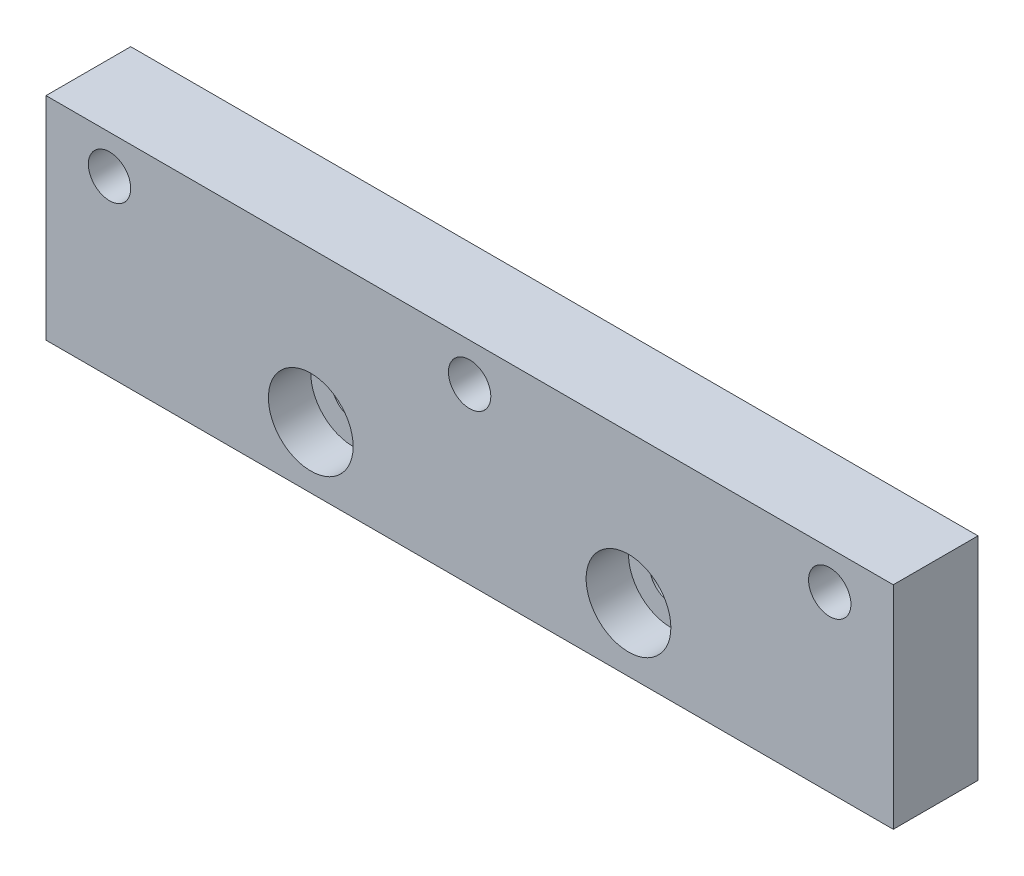
ISO-10303-21;
HEADER;
FILE_DESCRIPTION(('STEP AP214'),'2;1');
FILE_NAME('part.step','',(''),(''),'','','');
FILE_SCHEMA(('AUTOMOTIVE_DESIGN { 1 0 10303 214 1 1 1 1 }'));
ENDSEC;
DATA;
#1=APPLICATION_CONTEXT('core data for automotive mechanical design processes');
#2=APPLICATION_PROTOCOL_DEFINITION('international standard','automotive_design',2000,#1);
#3=PRODUCT_CONTEXT('',#1,'mechanical');
#4=PRODUCT('Part','Part','',(#3));
#5=PRODUCT_RELATED_PRODUCT_CATEGORY('part','',(#4));
#6=PRODUCT_DEFINITION_FORMATION('','',#4);
#7=PRODUCT_DEFINITION_CONTEXT('part definition',#1,'design');
#8=PRODUCT_DEFINITION('design','',#6,#7);
#9=PRODUCT_DEFINITION_SHAPE('','',#8);
#10=(LENGTH_UNIT() NAMED_UNIT(*) SI_UNIT(.MILLI.,.METRE.));
#11=(NAMED_UNIT(*) PLANE_ANGLE_UNIT() SI_UNIT($,.RADIAN.));
#12=(NAMED_UNIT(*) SI_UNIT($,.STERADIAN.) SOLID_ANGLE_UNIT());
#13=UNCERTAINTY_MEASURE_WITH_UNIT(LENGTH_MEASURE(1.E-05),#10,'distance_accuracy_value','');
#14=(GEOMETRIC_REPRESENTATION_CONTEXT(3) GLOBAL_UNCERTAINTY_ASSIGNED_CONTEXT((#13)) GLOBAL_UNIT_ASSIGNED_CONTEXT((#10,
#11,#12)) REPRESENTATION_CONTEXT('',''));
#15=CARTESIAN_POINT('',(0.,0.,0.));
#16=DIRECTION('',(0.,0.,1.));
#17=DIRECTION('',(1.,0.,0.));
#18=AXIS2_PLACEMENT_3D('',#15,#16,#17);
#19=CARTESIAN_POINT('',(-7.5,-2.,0.));
#20=DIRECTION('',(0.,0.,1.));
#21=DIRECTION('',(1.,0.,0.));
#22=AXIS2_PLACEMENT_3D('',#19,#20,#21);
#23=CYLINDRICAL_SURFACE('',#22,1.);
#24=CARTESIAN_POINT('',(-7.5,-2.,0.));
#25=DIRECTION('',(0.,0.,1.));
#26=DIRECTION('',(1.,0.,0.));
#27=AXIS2_PLACEMENT_3D('',#24,#25,#26);
#28=CIRCLE('',#27,1.);
#29=CARTESIAN_POINT('',(-6.5,-2.,0.));
#30=VERTEX_POINT('',#29);
#31=EDGE_CURVE('E117',#30,#30,#28,.T.);
#32=ORIENTED_EDGE('',*,*,#31,.F.);
#33=EDGE_LOOP('',(#32));
#34=FACE_BOUND('',#33,.T.);
#35=CARTESIAN_POINT('',(-7.5,-2.,2.));
#36=DIRECTION('',(0.,0.,1.));
#37=DIRECTION('',(1.,0.,0.));
#38=AXIS2_PLACEMENT_3D('',#35,#36,#37);
#39=CIRCLE('',#38,1.);
#40=CARTESIAN_POINT('',(-6.5,-2.,2.));
#41=VERTEX_POINT('',#40);
#42=EDGE_CURVE('E40',#41,#41,#39,.F.);
#43=ORIENTED_EDGE('',*,*,#42,.F.);
#44=EDGE_LOOP('',(#43));
#45=FACE_BOUND('',#44,.T.);
#46=ADVANCED_FACE('F36',(#34,#45),#23,.F.);
#47=CARTESIAN_POINT('',(7.5,-2.,0.));
#48=DIRECTION('',(0.,0.,1.));
#49=DIRECTION('',(1.,0.,0.));
#50=AXIS2_PLACEMENT_3D('',#47,#48,#49);
#51=CYLINDRICAL_SURFACE('',#50,1.);
#52=CARTESIAN_POINT('',(7.5,-2.,0.));
#53=DIRECTION('',(0.,0.,1.));
#54=DIRECTION('',(1.,0.,0.));
#55=AXIS2_PLACEMENT_3D('',#52,#53,#54);
#56=CIRCLE('',#55,1.);
#57=CARTESIAN_POINT('',(8.5,-2.,0.));
#58=VERTEX_POINT('',#57);
#59=EDGE_CURVE('E149',#58,#58,#56,.T.);
#60=ORIENTED_EDGE('',*,*,#59,.F.);
#61=EDGE_LOOP('',(#60));
#62=FACE_BOUND('',#61,.T.);
#63=CARTESIAN_POINT('',(7.5,-2.,2.));
#64=DIRECTION('',(0.,0.,1.));
#65=DIRECTION('',(1.,0.,0.));
#66=AXIS2_PLACEMENT_3D('',#63,#64,#65);
#67=CIRCLE('',#66,1.);
#68=CARTESIAN_POINT('',(8.5,-2.,2.));
#69=VERTEX_POINT('',#68);
#70=EDGE_CURVE('E111',#69,#69,#67,.F.);
#71=ORIENTED_EDGE('',*,*,#70,.F.);
#72=EDGE_LOOP('',(#71));
#73=FACE_BOUND('',#72,.T.);
#74=ADVANCED_FACE('F160',(#62,#73),#51,.F.);
#75=CARTESIAN_POINT('',(20.,5.,4.));
#76=DIRECTION('',(-1.,0.,0.));
#77=DIRECTION('',(0.,0.,1.));
#78=AXIS2_PLACEMENT_3D('',#75,#76,#77);
#79=PLANE('',#78);
#80=DIRECTION('',(0.,1.,0.));
#81=VECTOR('',#80,1.);
#82=CARTESIAN_POINT('',(20.,5.,0.));
#83=LINE('',#82,#81);
#84=CARTESIAN_POINT('',(20.,-5.,0.));
#85=VERTEX_POINT('',#84);
#86=CARTESIAN_POINT('',(20.,5.,0.));
#87=VERTEX_POINT('',#86);
#88=EDGE_CURVE('E103',#85,#87,#83,.T.);
#89=ORIENTED_EDGE('',*,*,#88,.T.);
#90=DIRECTION('',(0.,0.,-1.));
#91=VECTOR('',#90,1.);
#92=CARTESIAN_POINT('',(20.,5.,4.));
#93=LINE('',#92,#91);
#94=CARTESIAN_POINT('',(20.,5.,4.));
#95=VERTEX_POINT('',#94);
#96=EDGE_CURVE('E11',#95,#87,#93,.T.);
#97=ORIENTED_EDGE('',*,*,#96,.F.);
#98=DIRECTION('',(0.,1.,0.));
#99=VECTOR('',#98,1.);
#100=CARTESIAN_POINT('',(20.,5.,4.));
#101=LINE('',#100,#99);
#102=CARTESIAN_POINT('',(20.,-5.,4.));
#103=VERTEX_POINT('',#102);
#104=EDGE_CURVE('E90',#103,#95,#101,.T.);
#105=ORIENTED_EDGE('',*,*,#104,.F.);
#106=DIRECTION('',(0.,0.,-1.));
#107=VECTOR('',#106,1.);
#108=CARTESIAN_POINT('',(20.,-5.,4.));
#109=LINE('',#108,#107);
#110=EDGE_CURVE('E99',#103,#85,#109,.T.);
#111=ORIENTED_EDGE('',*,*,#110,.T.);
#112=EDGE_LOOP('',(#89,#97,#105,#111));
#113=FACE_BOUND('',#112,.T.);
#114=ADVANCED_FACE('F38',(#113),#79,.F.);
#115=CARTESIAN_POINT('',(-20.,5.,4.));
#116=DIRECTION('',(0.,-1.,0.));
#117=DIRECTION('',(0.,0.,-1.));
#118=AXIS2_PLACEMENT_3D('',#115,#116,#117);
#119=PLANE('',#118);
#120=DIRECTION('',(-1.,0.,0.));
#121=VECTOR('',#120,1.);
#122=CARTESIAN_POINT('',(-20.,5.,0.));
#123=LINE('',#122,#121);
#124=CARTESIAN_POINT('',(-20.,5.,0.));
#125=VERTEX_POINT('',#124);
#126=EDGE_CURVE('E94',#87,#125,#123,.T.);
#127=ORIENTED_EDGE('',*,*,#126,.T.);
#128=DIRECTION('',(0.,0.,-1.));
#129=VECTOR('',#128,1.);
#130=CARTESIAN_POINT('',(-20.,5.,4.));
#131=LINE('',#130,#129);
#132=CARTESIAN_POINT('',(-20.,5.,4.));
#133=VERTEX_POINT('',#132);
#134=EDGE_CURVE('E46',#133,#125,#131,.T.);
#135=ORIENTED_EDGE('',*,*,#134,.F.);
#136=DIRECTION('',(-1.,0.,0.));
#137=VECTOR('',#136,1.);
#138=CARTESIAN_POINT('',(-20.,5.,4.));
#139=LINE('',#138,#137);
#140=EDGE_CURVE('E85',#95,#133,#139,.T.);
#141=ORIENTED_EDGE('',*,*,#140,.F.);
#142=ORIENTED_EDGE('',*,*,#96,.T.);
#143=EDGE_LOOP('',(#127,#135,#141,#142));
#144=FACE_BOUND('',#143,.T.);
#145=ADVANCED_FACE('F93',(#144),#119,.F.);
#146=CARTESIAN_POINT('',(-20.,5.,4.));
#147=DIRECTION('',(1.,0.,0.));
#148=DIRECTION('',(0.,0.,-1.));
#149=AXIS2_PLACEMENT_3D('',#146,#147,#148);
#150=PLANE('',#149);
#151=DIRECTION('',(0.,-1.,0.));
#152=VECTOR('',#151,1.);
#153=CARTESIAN_POINT('',(-20.,5.,0.));
#154=LINE('',#153,#152);
#155=CARTESIAN_POINT('',(-20.,-5.,0.));
#156=VERTEX_POINT('',#155);
#157=EDGE_CURVE('E72',#125,#156,#154,.T.);
#158=ORIENTED_EDGE('',*,*,#157,.T.);
#159=DIRECTION('',(0.,0.,-1.));
#160=VECTOR('',#159,1.);
#161=CARTESIAN_POINT('',(-20.,-5.,4.));
#162=LINE('',#161,#160);
#163=CARTESIAN_POINT('',(-20.,-5.,4.));
#164=VERTEX_POINT('',#163);
#165=EDGE_CURVE('E95',#164,#156,#162,.T.);
#166=ORIENTED_EDGE('',*,*,#165,.F.);
#167=DIRECTION('',(0.,-1.,0.));
#168=VECTOR('',#167,1.);
#169=CARTESIAN_POINT('',(-20.,5.,4.));
#170=LINE('',#169,#168);
#171=EDGE_CURVE('E88',#133,#164,#170,.T.);
#172=ORIENTED_EDGE('',*,*,#171,.F.);
#173=ORIENTED_EDGE('',*,*,#134,.T.);
#174=EDGE_LOOP('',(#158,#166,#172,#173));
#175=FACE_BOUND('',#174,.T.);
#176=ADVANCED_FACE('F97',(#175),#150,.F.);
#177=CARTESIAN_POINT('',(-20.,-5.,4.));
#178=DIRECTION('',(0.,1.,0.));
#179=DIRECTION('',(0.,0.,1.));
#180=AXIS2_PLACEMENT_3D('',#177,#178,#179);
#181=PLANE('',#180);
#182=DIRECTION('',(1.,0.,0.));
#183=VECTOR('',#182,1.);
#184=CARTESIAN_POINT('',(-20.,-5.,0.));
#185=LINE('',#184,#183);
#186=EDGE_CURVE('E78',#156,#85,#185,.T.);
#187=ORIENTED_EDGE('',*,*,#186,.T.);
#188=ORIENTED_EDGE('',*,*,#110,.F.);
#189=DIRECTION('',(1.,0.,0.));
#190=VECTOR('',#189,1.);
#191=CARTESIAN_POINT('',(-20.,-5.,4.));
#192=LINE('',#191,#190);
#193=EDGE_CURVE('E55',#164,#103,#192,.T.);
#194=ORIENTED_EDGE('',*,*,#193,.F.);
#195=ORIENTED_EDGE('',*,*,#165,.T.);
#196=EDGE_LOOP('',(#187,#188,#194,#195));
#197=FACE_BOUND('',#196,.T.);
#198=ADVANCED_FACE('F199',(#197),#181,.F.);
#199=CARTESIAN_POINT('',(0.,0.,4.));
#200=DIRECTION('',(0.,0.,1.));
#201=DIRECTION('',(1.,0.,0.));
#202=AXIS2_PLACEMENT_3D('',#199,#200,#201);
#203=PLANE('',#202);
#204=CARTESIAN_POINT('',(-7.49999999999999,-2.09999999999997,4.));
#205=DIRECTION('',(0.,0.,1.));
#206=DIRECTION('',(1.,0.,0.));
#207=AXIS2_PLACEMENT_3D('',#204,#205,#206);
#208=CIRCLE('',#207,2.);
#209=CARTESIAN_POINT('',(-5.49999999999999,-2.09999999999997,4.));
#210=VERTEX_POINT('',#209);
#211=EDGE_CURVE('E119',#210,#210,#208,.T.);
#212=ORIENTED_EDGE('',*,*,#211,.F.);
#213=EDGE_LOOP('',(#212));
#214=FACE_BOUND('',#213,.T.);
#215=CARTESIAN_POINT('',(7.5,-2.,4.));
#216=DIRECTION('',(0.,0.,1.));
#217=DIRECTION('',(1.,0.,0.));
#218=AXIS2_PLACEMENT_3D('',#215,#216,#217);
#219=CIRCLE('',#218,2.);
#220=CARTESIAN_POINT('',(9.5,-2.,4.));
#221=VERTEX_POINT('',#220);
#222=EDGE_CURVE('E124',#221,#221,#219,.T.);
#223=ORIENTED_EDGE('',*,*,#222,.F.);
#224=EDGE_LOOP('',(#223));
#225=FACE_BOUND('',#224,.T.);
#226=CARTESIAN_POINT('',(-16.9999999999991,3.20000000000005,4.));
#227=DIRECTION('',(0.,0.,1.));
#228=DIRECTION('',(1.,0.,0.));
#229=AXIS2_PLACEMENT_3D('',#226,#227,#228);
#230=CIRCLE('',#229,1.);
#231=CARTESIAN_POINT('',(-15.9999999999991,3.20000000000005,4.));
#232=VERTEX_POINT('',#231);
#233=EDGE_CURVE('E134',#232,#232,#230,.T.);
#234=ORIENTED_EDGE('',*,*,#233,.F.);
#235=EDGE_LOOP('',(#234));
#236=FACE_BOUND('',#235,.T.);
#237=CARTESIAN_POINT('',(8.98586760555986E-13,3.20000000000005,4.));
#238=DIRECTION('',(0.,0.,1.));
#239=DIRECTION('',(1.,0.,0.));
#240=AXIS2_PLACEMENT_3D('',#237,#238,#239);
#241=CIRCLE('',#240,1.);
#242=CARTESIAN_POINT('',(1.0000000000009,3.20000000000005,4.));
#243=VERTEX_POINT('',#242);
#244=EDGE_CURVE('E137',#243,#243,#241,.T.);
#245=ORIENTED_EDGE('',*,*,#244,.F.);
#246=EDGE_LOOP('',(#245));
#247=FACE_BOUND('',#246,.T.);
#248=CARTESIAN_POINT('',(17.0000000000009,3.20000000000005,4.));
#249=DIRECTION('',(0.,0.,1.));
#250=DIRECTION('',(1.,0.,0.));
#251=AXIS2_PLACEMENT_3D('',#248,#249,#250);
#252=CIRCLE('',#251,1.);
#253=CARTESIAN_POINT('',(18.0000000000009,3.20000000000005,4.));
#254=VERTEX_POINT('',#253);
#255=EDGE_CURVE('E143',#254,#254,#252,.T.);
#256=ORIENTED_EDGE('',*,*,#255,.F.);
#257=EDGE_LOOP('',(#256));
#258=FACE_BOUND('',#257,.T.);
#259=ORIENTED_EDGE('',*,*,#104,.T.);
#260=ORIENTED_EDGE('',*,*,#140,.T.);
#261=ORIENTED_EDGE('',*,*,#171,.T.);
#262=ORIENTED_EDGE('',*,*,#193,.T.);
#263=EDGE_LOOP('',(#259,#260,#261,#262));
#264=FACE_BOUND('',#263,.T.);
#265=ADVANCED_FACE('F86',(#214,#225,#236,#247,#258,#264),#203,.T.);
#266=CARTESIAN_POINT('',(0.,0.,0.));
#267=DIRECTION('',(0.,0.,1.));
#268=DIRECTION('',(1.,0.,0.));
#269=AXIS2_PLACEMENT_3D('',#266,#267,#268);
#270=PLANE('',#269);
#271=CARTESIAN_POINT('',(-16.9999999999991,3.20000000000005,0.));
#272=DIRECTION('',(0.,0.,1.));
#273=DIRECTION('',(1.,0.,0.));
#274=AXIS2_PLACEMENT_3D('',#271,#272,#273);
#275=CIRCLE('',#274,1.);
#276=CARTESIAN_POINT('',(-15.9999999999991,3.20000000000005,0.));
#277=VERTEX_POINT('',#276);
#278=EDGE_CURVE('E106',#277,#277,#275,.T.);
#279=ORIENTED_EDGE('',*,*,#278,.T.);
#280=EDGE_LOOP('',(#279));
#281=FACE_BOUND('',#280,.T.);
#282=CARTESIAN_POINT('',(8.98586760555986E-13,3.20000000000005,0.));
#283=DIRECTION('',(0.,0.,1.));
#284=DIRECTION('',(1.,0.,0.));
#285=AXIS2_PLACEMENT_3D('',#282,#283,#284);
#286=CIRCLE('',#285,1.);
#287=CARTESIAN_POINT('',(1.0000000000009,3.20000000000005,0.));
#288=VERTEX_POINT('',#287);
#289=EDGE_CURVE('E140',#288,#288,#286,.T.);
#290=ORIENTED_EDGE('',*,*,#289,.T.);
#291=EDGE_LOOP('',(#290));
#292=FACE_BOUND('',#291,.T.);
#293=CARTESIAN_POINT('',(17.0000000000009,3.20000000000005,0.));
#294=DIRECTION('',(0.,0.,1.));
#295=DIRECTION('',(1.,0.,0.));
#296=AXIS2_PLACEMENT_3D('',#293,#294,#295);
#297=CIRCLE('',#296,1.);
#298=CARTESIAN_POINT('',(18.0000000000009,3.20000000000005,0.));
#299=VERTEX_POINT('',#298);
#300=EDGE_CURVE('E146',#299,#299,#297,.T.);
#301=ORIENTED_EDGE('',*,*,#300,.T.);
#302=EDGE_LOOP('',(#301));
#303=FACE_BOUND('',#302,.T.);
#304=ORIENTED_EDGE('',*,*,#59,.T.);
#305=EDGE_LOOP('',(#304));
#306=FACE_BOUND('',#305,.T.);
#307=ORIENTED_EDGE('',*,*,#31,.T.);
#308=EDGE_LOOP('',(#307));
#309=FACE_BOUND('',#308,.T.);
#310=ORIENTED_EDGE('',*,*,#88,.F.);
#311=ORIENTED_EDGE('',*,*,#186,.F.);
#312=ORIENTED_EDGE('',*,*,#157,.F.);
#313=ORIENTED_EDGE('',*,*,#126,.F.);
#314=EDGE_LOOP('',(#310,#311,#312,#313));
#315=FACE_BOUND('',#314,.T.);
#316=ADVANCED_FACE('F155',(#281,#292,#303,#306,#309,#315),#270,.F.);
#317=CARTESIAN_POINT('',(17.0000000000009,3.20000000000005,0.));
#318=DIRECTION('',(0.,0.,1.));
#319=DIRECTION('',(1.,0.,0.));
#320=AXIS2_PLACEMENT_3D('',#317,#318,#319);
#321=CYLINDRICAL_SURFACE('',#320,1.);
#322=ORIENTED_EDGE('',*,*,#300,.F.);
#323=EDGE_LOOP('',(#322));
#324=FACE_BOUND('',#323,.T.);
#325=ORIENTED_EDGE('',*,*,#255,.T.);
#326=EDGE_LOOP('',(#325));
#327=FACE_BOUND('',#326,.T.);
#328=ADVANCED_FACE('F189',(#324,#327),#321,.F.);
#329=CARTESIAN_POINT('',(8.98586760555986E-13,3.20000000000005,0.));
#330=DIRECTION('',(0.,0.,1.));
#331=DIRECTION('',(1.,0.,0.));
#332=AXIS2_PLACEMENT_3D('',#329,#330,#331);
#333=CYLINDRICAL_SURFACE('',#332,1.);
#334=ORIENTED_EDGE('',*,*,#289,.F.);
#335=EDGE_LOOP('',(#334));
#336=FACE_BOUND('',#335,.T.);
#337=ORIENTED_EDGE('',*,*,#244,.T.);
#338=EDGE_LOOP('',(#337));
#339=FACE_BOUND('',#338,.T.);
#340=ADVANCED_FACE('F185',(#336,#339),#333,.F.);
#341=CARTESIAN_POINT('',(-16.9999999999991,3.20000000000005,0.));
#342=DIRECTION('',(0.,0.,1.));
#343=DIRECTION('',(1.,0.,0.));
#344=AXIS2_PLACEMENT_3D('',#341,#342,#343);
#345=CYLINDRICAL_SURFACE('',#344,1.);
#346=ORIENTED_EDGE('',*,*,#278,.F.);
#347=EDGE_LOOP('',(#346));
#348=FACE_BOUND('',#347,.T.);
#349=ORIENTED_EDGE('',*,*,#233,.T.);
#350=EDGE_LOOP('',(#349));
#351=FACE_BOUND('',#350,.T.);
#352=ADVANCED_FACE('F181',(#348,#351),#345,.F.);
#353=CARTESIAN_POINT('',(7.5,-2.,2.));
#354=DIRECTION('',(0.,0.,1.));
#355=DIRECTION('',(1.,0.,0.));
#356=AXIS2_PLACEMENT_3D('',#353,#354,#355);
#357=PLANE('',#356);
#358=CARTESIAN_POINT('',(7.5,-2.,2.));
#359=DIRECTION('',(0.,0.,1.));
#360=DIRECTION('',(1.,0.,0.));
#361=AXIS2_PLACEMENT_3D('',#358,#359,#360);
#362=CIRCLE('',#361,2.);
#363=CARTESIAN_POINT('',(9.5,-2.,2.));
#364=VERTEX_POINT('',#363);
#365=EDGE_CURVE('E129',#364,#364,#362,.T.);
#366=ORIENTED_EDGE('',*,*,#365,.T.);
#367=EDGE_LOOP('',(#366));
#368=FACE_BOUND('',#367,.T.);
#369=ORIENTED_EDGE('',*,*,#70,.T.);
#370=EDGE_LOOP('',(#369));
#371=FACE_BOUND('',#370,.T.);
#372=ADVANCED_FACE('F175',(#368,#371),#357,.T.);
#373=CARTESIAN_POINT('',(7.5,-2.,2.));
#374=DIRECTION('',(0.,0.,1.));
#375=DIRECTION('',(1.,0.,0.));
#376=AXIS2_PLACEMENT_3D('',#373,#374,#375);
#377=CYLINDRICAL_SURFACE('',#376,2.);
#378=ORIENTED_EDGE('',*,*,#365,.F.);
#379=EDGE_LOOP('',(#378));
#380=FACE_BOUND('',#379,.T.);
#381=ORIENTED_EDGE('',*,*,#222,.T.);
#382=EDGE_LOOP('',(#381));
#383=FACE_BOUND('',#382,.T.);
#384=ADVANCED_FACE('F167',(#380,#383),#377,.F.);
#385=CARTESIAN_POINT('',(-7.49999999999999,-2.09999999999997,2.));
#386=DIRECTION('',(0.,0.,1.));
#387=DIRECTION('',(1.,0.,0.));
#388=AXIS2_PLACEMENT_3D('',#385,#386,#387);
#389=PLANE('',#388);
#390=CARTESIAN_POINT('',(-7.49999999999999,-2.09999999999997,2.));
#391=DIRECTION('',(0.,0.,1.));
#392=DIRECTION('',(1.,0.,0.));
#393=AXIS2_PLACEMENT_3D('',#390,#391,#392);
#394=CIRCLE('',#393,2.);
#395=CARTESIAN_POINT('',(-5.49999999999999,-2.09999999999997,2.));
#396=VERTEX_POINT('',#395);
#397=EDGE_CURVE('E113',#396,#396,#394,.T.);
#398=ORIENTED_EDGE('',*,*,#397,.T.);
#399=EDGE_LOOP('',(#398));
#400=FACE_BOUND('',#399,.T.);
#401=ORIENTED_EDGE('',*,*,#42,.T.);
#402=EDGE_LOOP('',(#401));
#403=FACE_BOUND('',#402,.T.);
#404=ADVANCED_FACE('F164',(#400,#403),#389,.T.);
#405=CARTESIAN_POINT('',(-7.49999999999999,-2.09999999999997,2.));
#406=DIRECTION('',(0.,0.,1.));
#407=DIRECTION('',(1.,0.,0.));
#408=AXIS2_PLACEMENT_3D('',#405,#406,#407);
#409=CYLINDRICAL_SURFACE('',#408,2.);
#410=ORIENTED_EDGE('',*,*,#397,.F.);
#411=EDGE_LOOP('',(#410));
#412=FACE_BOUND('',#411,.T.);
#413=ORIENTED_EDGE('',*,*,#211,.T.);
#414=EDGE_LOOP('',(#413));
#415=FACE_BOUND('',#414,.T.);
#416=ADVANCED_FACE('F166',(#412,#415),#409,.F.);
#417=CLOSED_SHELL('',(#46,#74,#114,#145,#176,#198,#265,#316,#328,#340,#352,#372,#384,#404,#416));
#418=MANIFOLD_SOLID_BREP('B2',#417);
#419=ADVANCED_BREP_SHAPE_REPRESENTATION('',(#18,#418),#14);
#420=SHAPE_DEFINITION_REPRESENTATION(#9,#419);
ENDSEC;
END-ISO-10303-21;
